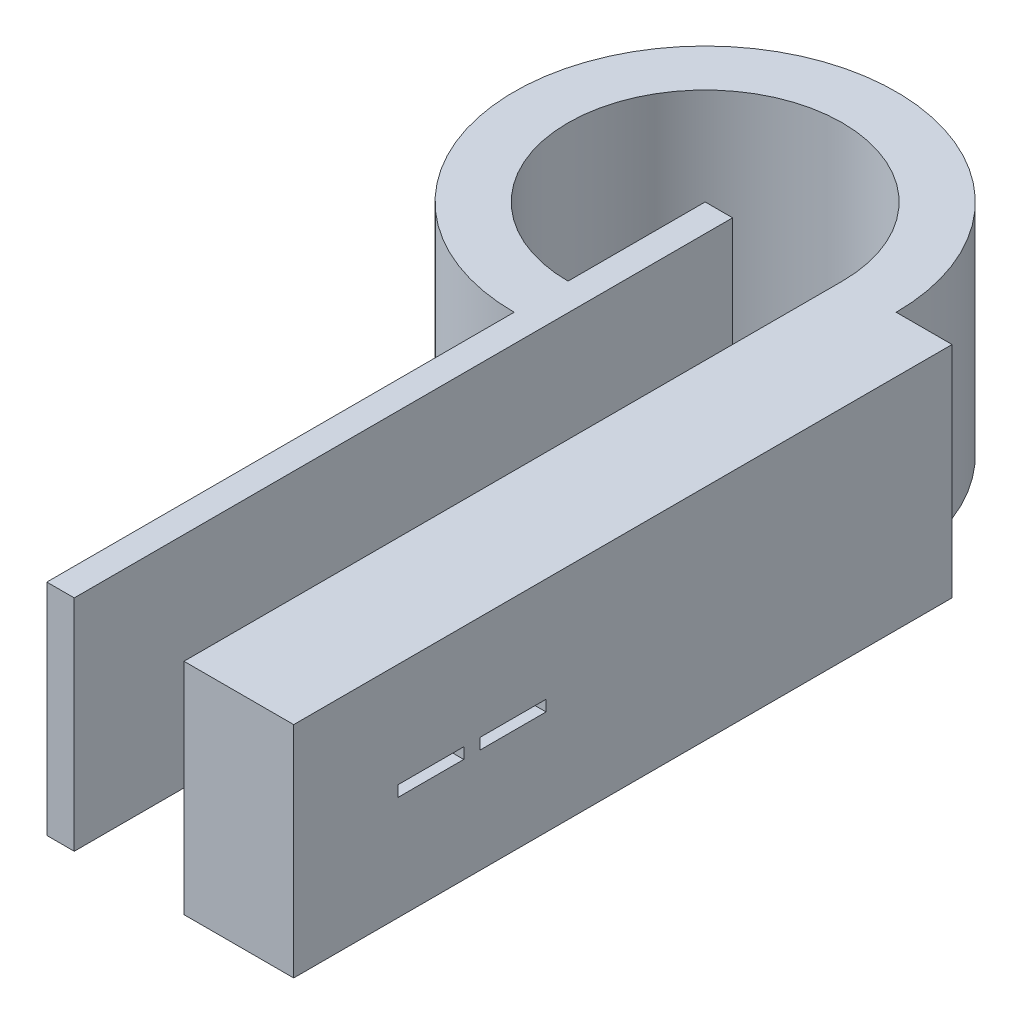
ISO-10303-21;
HEADER;
FILE_DESCRIPTION(('STEP AP214'),'2;1');
FILE_NAME('part.step','',(''),(''),'','','');
FILE_SCHEMA(('AUTOMOTIVE_DESIGN { 1 0 10303 214 1 1 1 1 }'));
ENDSEC;
DATA;
#1=APPLICATION_CONTEXT('core data for automotive mechanical design processes');
#2=APPLICATION_PROTOCOL_DEFINITION('international standard','automotive_design',2000,#1);
#3=PRODUCT_CONTEXT('',#1,'mechanical');
#4=PRODUCT('Part','Part','',(#3));
#5=PRODUCT_RELATED_PRODUCT_CATEGORY('part','',(#4));
#6=PRODUCT_DEFINITION_FORMATION('','',#4);
#7=PRODUCT_DEFINITION_CONTEXT('part definition',#1,'design');
#8=PRODUCT_DEFINITION('design','',#6,#7);
#9=PRODUCT_DEFINITION_SHAPE('','',#8);
#10=(LENGTH_UNIT() NAMED_UNIT(*) SI_UNIT(.MILLI.,.METRE.));
#11=(NAMED_UNIT(*) PLANE_ANGLE_UNIT() SI_UNIT($,.RADIAN.));
#12=(NAMED_UNIT(*) SI_UNIT($,.STERADIAN.) SOLID_ANGLE_UNIT());
#13=UNCERTAINTY_MEASURE_WITH_UNIT(LENGTH_MEASURE(1.E-05),#10,'distance_accuracy_value','');
#14=(GEOMETRIC_REPRESENTATION_CONTEXT(3) GLOBAL_UNCERTAINTY_ASSIGNED_CONTEXT((#13)) GLOBAL_UNIT_ASSIGNED_CONTEXT((#10,
#11,#12)) REPRESENTATION_CONTEXT('',''));
#15=CARTESIAN_POINT('',(0.,0.,0.));
#16=DIRECTION('',(0.,0.,1.));
#17=DIRECTION('',(1.,0.,0.));
#18=AXIS2_PLACEMENT_3D('',#15,#16,#17);
#19=CARTESIAN_POINT('',(-31.301242738674,20.,0.));
#20=DIRECTION('',(1.,0.,0.));
#21=DIRECTION('',(0.,0.,-1.));
#22=AXIS2_PLACEMENT_3D('',#19,#20,#21);
#23=PLANE('',#22);
#24=DIRECTION('',(0.,0.,1.));
#25=VECTOR('',#24,1.);
#26=CARTESIAN_POINT('',(-31.301242738674,0.,0.));
#27=LINE('',#26,#25);
#28=CARTESIAN_POINT('',(-31.301242738674,0.,-22.7488967204412));
#29=VERTEX_POINT('',#28);
#30=CARTESIAN_POINT('',(-31.301242738674,0.,37.2511032795588));
#31=VERTEX_POINT('',#30);
#32=EDGE_CURVE('E367',#29,#31,#27,.T.);
#33=ORIENTED_EDGE('',*,*,#32,.T.);
#34=DIRECTION('',(0.,-1.,0.));
#35=VECTOR('',#34,1.);
#36=CARTESIAN_POINT('',(-31.301242738674,20.,37.2511032795588));
#37=LINE('',#36,#35);
#38=CARTESIAN_POINT('',(-31.301242738674,20.,37.2511032795588));
#39=VERTEX_POINT('',#38);
#40=EDGE_CURVE('E400',#39,#31,#37,.T.);
#41=ORIENTED_EDGE('',*,*,#40,.F.);
#42=DIRECTION('',(0.,0.,1.));
#43=VECTOR('',#42,1.);
#44=CARTESIAN_POINT('',(-31.301242738674,20.,0.));
#45=LINE('',#44,#43);
#46=CARTESIAN_POINT('',(-31.301242738674,20.,-22.7488967204412));
#47=VERTEX_POINT('',#46);
#48=EDGE_CURVE('E343',#47,#39,#45,.T.);
#49=ORIENTED_EDGE('',*,*,#48,.F.);
#50=DIRECTION('',(0.,-1.,0.));
#51=VECTOR('',#50,1.);
#52=CARTESIAN_POINT('',(-31.301242738674,20.,-22.7488967204412));
#53=LINE('',#52,#51);
#54=EDGE_CURVE('E404',#47,#29,#53,.T.);
#55=ORIENTED_EDGE('',*,*,#54,.T.);
#56=EDGE_LOOP('',(#33,#41,#49,#55));
#57=FACE_BOUND('',#56,.T.);
#58=CARTESIAN_POINT('',(-31.301242738674,10.,17.2511032795588));
#59=DIRECTION('',(-1.,0.,0.));
#60=DIRECTION('',(0.,0.,1.));
#61=AXIS2_PLACEMENT_3D('',#58,#59,#60);
#62=CIRCLE('',#61,4.);
#63=CARTESIAN_POINT('',(-31.301242738674,10.,21.2511032795588));
#64=VERTEX_POINT('',#63);
#65=EDGE_CURVE('E293',#64,#64,#62,.T.);
#66=ORIENTED_EDGE('',*,*,#65,.F.);
#67=EDGE_LOOP('',(#66));
#68=FACE_BOUND('',#67,.T.);
#69=DIRECTION('',(0.,0.,1.));
#70=VECTOR('',#69,1.);
#71=CARTESIAN_POINT('',(-31.301242738674,10.5,0.));
#72=LINE('',#71,#70);
#73=CARTESIAN_POINT('',(-31.301242738674,10.5,21.7511032795588));
#74=VERTEX_POINT('',#73);
#75=CARTESIAN_POINT('',(-31.301242738674,10.5,22.1996331151242));
#76=VERTEX_POINT('',#75);
#77=EDGE_CURVE('E248',#74,#76,#72,.T.);
#78=ORIENTED_EDGE('',*,*,#77,.T.);
#79=CARTESIAN_POINT('',(-31.301242738674,10.,24.7511032795588));
#80=DIRECTION('',(-1.,0.,0.));
#81=DIRECTION('',(0.,0.,1.));
#82=AXIS2_PLACEMENT_3D('',#79,#80,#81);
#83=CIRCLE('',#82,2.6);
#84=CARTESIAN_POINT('',(-31.301242738674,10.5,27.3025734439934));
#85=VERTEX_POINT('',#84);
#86=EDGE_CURVE('E235',#85,#76,#83,.T.);
#87=ORIENTED_EDGE('',*,*,#86,.F.);
#88=CARTESIAN_POINT('',(-31.301242738674,10.5,27.7511032795588));
#89=VERTEX_POINT('',#88);
#90=EDGE_CURVE('E244',#85,#89,#72,.T.);
#91=ORIENTED_EDGE('',*,*,#90,.T.);
#92=DIRECTION('',(0.,-1.,0.));
#93=VECTOR('',#92,1.);
#94=CARTESIAN_POINT('',(-31.301242738674,0.,27.7511032795588));
#95=LINE('',#94,#93);
#96=CARTESIAN_POINT('',(-31.301242738674,9.5,27.7511032795588));
#97=VERTEX_POINT('',#96);
#98=EDGE_CURVE('E261',#89,#97,#95,.T.);
#99=ORIENTED_EDGE('',*,*,#98,.T.);
#100=DIRECTION('',(0.,0.,1.));
#101=VECTOR('',#100,1.);
#102=CARTESIAN_POINT('',(-31.301242738674,9.5,0.));
#103=LINE('',#102,#101);
#104=CARTESIAN_POINT('',(-31.301242738674,9.5,27.3025734439934));
#105=VERTEX_POINT('',#104);
#106=EDGE_CURVE('E268',#105,#97,#103,.T.);
#107=ORIENTED_EDGE('',*,*,#106,.F.);
#108=CARTESIAN_POINT('',(-31.301242738674,9.5,22.1996331151242));
#109=VERTEX_POINT('',#108);
#110=EDGE_CURVE('E250',#109,#105,#83,.T.);
#111=ORIENTED_EDGE('',*,*,#110,.F.);
#112=CARTESIAN_POINT('',(-31.301242738674,9.5,21.7511032795588));
#113=VERTEX_POINT('',#112);
#114=EDGE_CURVE('E269',#113,#109,#103,.T.);
#115=ORIENTED_EDGE('',*,*,#114,.F.);
#116=DIRECTION('',(0.,-1.,0.));
#117=VECTOR('',#116,1.);
#118=CARTESIAN_POINT('',(-31.301242738674,0.,21.7511032795588));
#119=LINE('',#118,#117);
#120=EDGE_CURVE('E257',#74,#113,#119,.T.);
#121=ORIENTED_EDGE('',*,*,#120,.F.);
#122=EDGE_LOOP('',(#78,#87,#91,#99,#107,#111,#115,#121));
#123=FACE_BOUND('',#122,.T.);
#124=ADVANCED_FACE('F78',(#57,#68,#123),#23,.F.);
#125=CARTESIAN_POINT('',(-21.301242738674,20.,0.));
#126=DIRECTION('',(1.,0.,0.));
#127=DIRECTION('',(0.,0.,-1.));
#128=AXIS2_PLACEMENT_3D('',#125,#126,#127);
#129=PLANE('',#128);
#130=DIRECTION('',(0.,0.,1.));
#131=VECTOR('',#130,1.);
#132=CARTESIAN_POINT('',(-21.301242738674,0.,0.));
#133=LINE('',#132,#131);
#134=CARTESIAN_POINT('',(-21.301242738674,0.,-22.7488967204412));
#135=VERTEX_POINT('',#134);
#136=CARTESIAN_POINT('',(-21.301242738674,0.,37.2511032795588));
#137=VERTEX_POINT('',#136);
#138=EDGE_CURVE('E375',#135,#137,#133,.T.);
#139=ORIENTED_EDGE('',*,*,#138,.F.);
#140=DIRECTION('',(0.,-1.,0.));
#141=VECTOR('',#140,1.);
#142=CARTESIAN_POINT('',(-21.301242738674,20.,-22.7488967204412));
#143=LINE('',#142,#141);
#144=CARTESIAN_POINT('',(-21.301242738674,20.,-22.7488967204412));
#145=VERTEX_POINT('',#144);
#146=EDGE_CURVE('E394',#145,#135,#143,.T.);
#147=ORIENTED_EDGE('',*,*,#146,.F.);
#148=DIRECTION('',(0.,0.,1.));
#149=VECTOR('',#148,1.);
#150=CARTESIAN_POINT('',(-21.301242738674,20.,0.));
#151=LINE('',#150,#149);
#152=CARTESIAN_POINT('',(-21.301242738674,20.,37.2511032795588));
#153=VERTEX_POINT('',#152);
#154=EDGE_CURVE('E350',#145,#153,#151,.T.);
#155=ORIENTED_EDGE('',*,*,#154,.T.);
#156=DIRECTION('',(0.,-1.,0.));
#157=VECTOR('',#156,1.);
#158=CARTESIAN_POINT('',(-21.301242738674,20.,37.2511032795588));
#159=LINE('',#158,#157);
#160=EDGE_CURVE('E397',#153,#137,#159,.T.);
#161=ORIENTED_EDGE('',*,*,#160,.T.);
#162=EDGE_LOOP('',(#139,#147,#155,#161));
#163=FACE_BOUND('',#162,.T.);
#164=DIRECTION('',(0.,-1.,0.));
#165=VECTOR('',#164,1.);
#166=CARTESIAN_POINT('',(-21.301242738674,0.,14.2511032795588));
#167=LINE('',#166,#165);
#168=CARTESIAN_POINT('',(-21.301242738674,10.5,14.2511032795588));
#169=VERTEX_POINT('',#168);
#170=CARTESIAN_POINT('',(-21.301242738674,9.5,14.2511032795588));
#171=VERTEX_POINT('',#170);
#172=EDGE_CURVE('E306',#169,#171,#167,.T.);
#173=ORIENTED_EDGE('',*,*,#172,.T.);
#174=DIRECTION('',(0.,0.,1.));
#175=VECTOR('',#174,1.);
#176=CARTESIAN_POINT('',(-21.301242738674,9.5,0.));
#177=LINE('',#176,#175);
#178=CARTESIAN_POINT('',(-21.301242738674,9.5,20.2511032795588));
#179=VERTEX_POINT('',#178);
#180=EDGE_CURVE('E302',#171,#179,#177,.T.);
#181=ORIENTED_EDGE('',*,*,#180,.T.);
#182=DIRECTION('',(0.,-1.,0.));
#183=VECTOR('',#182,1.);
#184=CARTESIAN_POINT('',(-21.301242738674,0.,20.2511032795588));
#185=LINE('',#184,#183);
#186=CARTESIAN_POINT('',(-21.301242738674,10.5,20.2511032795588));
#187=VERTEX_POINT('',#186);
#188=EDGE_CURVE('E315',#187,#179,#185,.T.);
#189=ORIENTED_EDGE('',*,*,#188,.F.);
#190=DIRECTION('',(0.,0.,1.));
#191=VECTOR('',#190,1.);
#192=CARTESIAN_POINT('',(-21.301242738674,10.5,0.));
#193=LINE('',#192,#191);
#194=EDGE_CURVE('E311',#169,#187,#193,.T.);
#195=ORIENTED_EDGE('',*,*,#194,.F.);
#196=EDGE_LOOP('',(#173,#181,#189,#195));
#197=FACE_BOUND('',#196,.T.);
#198=DIRECTION('',(0.,0.,1.));
#199=VECTOR('',#198,1.);
#200=CARTESIAN_POINT('',(-21.301242738674,10.5,0.));
#201=LINE('',#200,#199);
#202=CARTESIAN_POINT('',(-21.301242738674,10.5,21.7511032795588));
#203=VERTEX_POINT('',#202);
#204=CARTESIAN_POINT('',(-21.301242738674,10.5,27.7511032795588));
#205=VERTEX_POINT('',#204);
#206=EDGE_CURVE('E278',#203,#205,#201,.T.);
#207=ORIENTED_EDGE('',*,*,#206,.F.);
#208=DIRECTION('',(0.,-1.,0.));
#209=VECTOR('',#208,1.);
#210=CARTESIAN_POINT('',(-21.301242738674,0.,21.7511032795588));
#211=LINE('',#210,#209);
#212=CARTESIAN_POINT('',(-21.301242738674,9.5,21.7511032795588));
#213=VERTEX_POINT('',#212);
#214=EDGE_CURVE('E274',#203,#213,#211,.T.);
#215=ORIENTED_EDGE('',*,*,#214,.T.);
#216=DIRECTION('',(0.,0.,1.));
#217=VECTOR('',#216,1.);
#218=CARTESIAN_POINT('',(-21.301242738674,9.5,0.));
#219=LINE('',#218,#217);
#220=CARTESIAN_POINT('',(-21.301242738674,9.5,27.7511032795588));
#221=VERTEX_POINT('',#220);
#222=EDGE_CURVE('E262',#213,#221,#219,.T.);
#223=ORIENTED_EDGE('',*,*,#222,.T.);
#224=DIRECTION('',(0.,-1.,0.));
#225=VECTOR('',#224,1.);
#226=CARTESIAN_POINT('',(-21.301242738674,0.,27.7511032795588));
#227=LINE('',#226,#225);
#228=EDGE_CURVE('E282',#205,#221,#227,.T.);
#229=ORIENTED_EDGE('',*,*,#228,.F.);
#230=EDGE_LOOP('',(#207,#215,#223,#229));
#231=FACE_BOUND('',#230,.T.);
#232=ADVANCED_FACE('F480',(#163,#197,#231),#129,.T.);
#233=CARTESIAN_POINT('',(-23.301242738674,0.,0.));
#234=DIRECTION('',(-1.,0.,0.));
#235=DIRECTION('',(0.,0.,1.));
#236=AXIS2_PLACEMENT_3D('',#233,#234,#235);
#237=PLANE('',#236);
#238=CARTESIAN_POINT('',(-23.301242738674,10.,17.2511032795588));
#239=DIRECTION('',(-1.,0.,0.));
#240=DIRECTION('',(0.,0.,1.));
#241=AXIS2_PLACEMENT_3D('',#238,#239,#240);
#242=CIRCLE('',#241,4.);
#243=CARTESIAN_POINT('',(-23.301242738674,10.,21.2511032795588));
#244=VERTEX_POINT('',#243);
#245=EDGE_CURVE('E331',#244,#244,#242,.T.);
#246=ORIENTED_EDGE('',*,*,#245,.T.);
#247=EDGE_LOOP('',(#246));
#248=FACE_BOUND('',#247,.T.);
#249=DIRECTION('',(0.,1.,0.));
#250=VECTOR('',#249,1.);
#251=CARTESIAN_POINT('',(-23.301242738674,0.,20.2511032795588));
#252=LINE('',#251,#250);
#253=CARTESIAN_POINT('',(-23.301242738674,9.5,20.2511032795588));
#254=VERTEX_POINT('',#253);
#255=CARTESIAN_POINT('',(-23.301242738674,10.5,20.2511032795588));
#256=VERTEX_POINT('',#255);
#257=EDGE_CURVE('E459',#254,#256,#252,.T.);
#258=ORIENTED_EDGE('',*,*,#257,.F.);
#259=DIRECTION('',(0.,0.,-1.));
#260=VECTOR('',#259,1.);
#261=CARTESIAN_POINT('',(-23.301242738674,9.5,0.));
#262=LINE('',#261,#260);
#263=CARTESIAN_POINT('',(-23.301242738674,9.5,14.2511032795588));
#264=VERTEX_POINT('',#263);
#265=EDGE_CURVE('E462',#254,#264,#262,.T.);
#266=ORIENTED_EDGE('',*,*,#265,.T.);
#267=DIRECTION('',(0.,1.,0.));
#268=VECTOR('',#267,1.);
#269=CARTESIAN_POINT('',(-23.301242738674,0.,14.2511032795588));
#270=LINE('',#269,#268);
#271=CARTESIAN_POINT('',(-23.301242738674,10.5,14.2511032795588));
#272=VERTEX_POINT('',#271);
#273=EDGE_CURVE('E407',#264,#272,#270,.T.);
#274=ORIENTED_EDGE('',*,*,#273,.T.);
#275=DIRECTION('',(0.,0.,-1.));
#276=VECTOR('',#275,1.);
#277=CARTESIAN_POINT('',(-23.301242738674,10.5,0.));
#278=LINE('',#277,#276);
#279=EDGE_CURVE('E455',#256,#272,#278,.T.);
#280=ORIENTED_EDGE('',*,*,#279,.F.);
#281=EDGE_LOOP('',(#258,#266,#274,#280));
#282=FACE_BOUND('',#281,.T.);
#283=ADVANCED_FACE('F553',(#248,#282),#237,.T.);
#284=CARTESIAN_POINT('',(0.,20.,37.2511032795588));
#285=DIRECTION('',(0.,0.,-1.));
#286=DIRECTION('',(-1.,0.,0.));
#287=AXIS2_PLACEMENT_3D('',#284,#285,#286);
#288=PLANE('',#287);
#289=DIRECTION('',(1.,0.,0.));
#290=VECTOR('',#289,1.);
#291=CARTESIAN_POINT('',(0.,0.,37.2511032795588));
#292=LINE('',#291,#290);
#293=EDGE_CURVE('E371',#31,#137,#292,.T.);
#294=ORIENTED_EDGE('',*,*,#293,.T.);
#295=ORIENTED_EDGE('',*,*,#160,.F.);
#296=DIRECTION('',(1.,0.,0.));
#297=VECTOR('',#296,1.);
#298=CARTESIAN_POINT('',(0.,20.,37.2511032795588));
#299=LINE('',#298,#297);
#300=EDGE_CURVE('E347',#39,#153,#299,.T.);
#301=ORIENTED_EDGE('',*,*,#300,.F.);
#302=ORIENTED_EDGE('',*,*,#40,.T.);
#303=EDGE_LOOP('',(#294,#295,#301,#302));
#304=FACE_BOUND('',#303,.T.);
#305=ADVANCED_FACE('F526',(#304),#288,.F.);
#306=CARTESIAN_POINT('',(0.,20.,-22.7488967204412));
#307=DIRECTION('',(0.,0.,-1.));
#308=DIRECTION('',(-1.,0.,0.));
#309=AXIS2_PLACEMENT_3D('',#306,#307,#308);
#310=PLANE('',#309);
#311=DIRECTION('',(1.,0.,0.));
#312=VECTOR('',#311,1.);
#313=CARTESIAN_POINT('',(0.,0.,-22.7488967204412));
#314=LINE('',#313,#312);
#315=CARTESIAN_POINT('',(-26.392335279018,0.,-22.7488967204412));
#316=VERTEX_POINT('',#315);
#317=EDGE_CURVE('E379',#316,#135,#314,.T.);
#318=ORIENTED_EDGE('',*,*,#317,.F.);
#319=DIRECTION('',(0.,-1.,0.));
#320=VECTOR('',#319,1.);
#321=CARTESIAN_POINT('',(-26.392335279018,20.,-22.7488967204412));
#322=LINE('',#321,#320);
#323=CARTESIAN_POINT('',(-26.392335279018,20.,-22.7488967204412));
#324=VERTEX_POINT('',#323);
#325=EDGE_CURVE('E391',#324,#316,#322,.T.);
#326=ORIENTED_EDGE('',*,*,#325,.F.);
#327=DIRECTION('',(1.,0.,0.));
#328=VECTOR('',#327,1.);
#329=CARTESIAN_POINT('',(0.,20.,-22.7488967204412));
#330=LINE('',#329,#328);
#331=EDGE_CURVE('E354',#324,#145,#330,.T.);
#332=ORIENTED_EDGE('',*,*,#331,.T.);
#333=ORIENTED_EDGE('',*,*,#146,.T.);
#334=EDGE_LOOP('',(#318,#326,#332,#333));
#335=FACE_BOUND('',#334,.T.);
#336=ADVANCED_FACE('F533',(#335),#310,.T.);
#337=CARTESIAN_POINT('',(-43.801242738674,20.,-22.7488967204412));
#338=DIRECTION('',(0.,-1.,0.));
#339=DIRECTION('',(0.,0.,-1.));
#340=AXIS2_PLACEMENT_3D('',#337,#338,#339);
#341=CYLINDRICAL_SURFACE('',#340,17.4089074596559);
#342=CARTESIAN_POINT('',(-43.801242738674,0.,-22.7488967204412));
#343=DIRECTION('',(0.,1.,0.));
#344=DIRECTION('',(0.,0.,1.));
#345=AXIS2_PLACEMENT_3D('',#342,#343,#344);
#346=CIRCLE('',#345,17.4089074596559);
#347=CARTESIAN_POINT('',(-43.801242738674,0.,-5.33998926078527));
#348=VERTEX_POINT('',#347);
#349=EDGE_CURVE('E344',#316,#348,#346,.T.);
#350=ORIENTED_EDGE('',*,*,#349,.T.);
#351=DIRECTION('',(0.,-1.,0.));
#352=VECTOR('',#351,1.);
#353=CARTESIAN_POINT('',(-43.801242738674,20.,-5.33998926078527));
#354=LINE('',#353,#352);
#355=CARTESIAN_POINT('',(-43.801242738674,20.,-5.33998926078527));
#356=VERTEX_POINT('',#355);
#357=EDGE_CURVE('E388',#356,#348,#354,.T.);
#358=ORIENTED_EDGE('',*,*,#357,.F.);
#359=CARTESIAN_POINT('',(-43.801242738674,20.,-22.7488967204412));
#360=DIRECTION('',(0.,1.,0.));
#361=DIRECTION('',(0.,0.,1.));
#362=AXIS2_PLACEMENT_3D('',#359,#360,#361);
#363=CIRCLE('',#362,17.4089074596559);
#364=EDGE_CURVE('E358',#324,#356,#363,.T.);
#365=ORIENTED_EDGE('',*,*,#364,.F.);
#366=ORIENTED_EDGE('',*,*,#325,.T.);
#367=EDGE_LOOP('',(#350,#358,#365,#366));
#368=FACE_BOUND('',#367,.T.);
#369=ADVANCED_FACE('F536',(#368),#341,.T.);
#370=CARTESIAN_POINT('',(-43.801242738674,20.,-22.7488967204412));
#371=DIRECTION('',(0.,-1.,0.));
#372=DIRECTION('',(0.,0.,-1.));
#373=AXIS2_PLACEMENT_3D('',#370,#371,#372);
#374=CYLINDRICAL_SURFACE('',#373,12.5);
#375=CARTESIAN_POINT('',(-43.801242738674,0.,-22.7488967204412));
#376=DIRECTION('',(0.,1.,0.));
#377=DIRECTION('',(0.,0.,1.));
#378=AXIS2_PLACEMENT_3D('',#375,#376,#377);
#379=CIRCLE('',#378,12.5);
#380=CARTESIAN_POINT('',(-43.801242738674,0.,-10.2488967204412));
#381=VERTEX_POINT('',#380);
#382=EDGE_CURVE('E363',#29,#381,#379,.T.);
#383=ORIENTED_EDGE('',*,*,#382,.F.);
#384=ORIENTED_EDGE('',*,*,#54,.F.);
#385=CARTESIAN_POINT('',(-43.801242738674,20.,-22.7488967204412));
#386=DIRECTION('',(0.,1.,0.));
#387=DIRECTION('',(0.,0.,1.));
#388=AXIS2_PLACEMENT_3D('',#385,#386,#387);
#389=CIRCLE('',#388,12.5);
#390=CARTESIAN_POINT('',(-43.801242738674,20.,-10.2488967204412));
#391=VERTEX_POINT('',#390);
#392=EDGE_CURVE('E339',#47,#391,#389,.T.);
#393=ORIENTED_EDGE('',*,*,#392,.T.);
#394=DIRECTION('',(0.,-1.,0.));
#395=VECTOR('',#394,1.);
#396=CARTESIAN_POINT('',(-43.801242738674,20.,-10.2488967204412));
#397=LINE('',#396,#395);
#398=EDGE_CURVE('E362',#391,#381,#397,.T.);
#399=ORIENTED_EDGE('',*,*,#398,.T.);
#400=EDGE_LOOP('',(#383,#384,#393,#399));
#401=FACE_BOUND('',#400,.T.);
#402=ADVANCED_FACE('F516',(#401),#374,.F.);
#403=CARTESIAN_POINT('',(0.,0.,0.));
#404=DIRECTION('',(0.,1.,0.));
#405=DIRECTION('',(0.,0.,1.));
#406=AXIS2_PLACEMENT_3D('',#403,#404,#405);
#407=PLANE('',#406);
#408=ORIENTED_EDGE('',*,*,#382,.T.);
#409=DIRECTION('',(0.,0.,1.));
#410=VECTOR('',#409,1.);
#411=CARTESIAN_POINT('',(-43.801242738674,0.,-22.7488967204412));
#412=LINE('',#411,#410);
#413=CARTESIAN_POINT('',(-43.801242738674,0.,-22.7488967204412));
#414=VERTEX_POINT('',#413);
#415=EDGE_CURVE('E413',#414,#381,#412,.T.);
#416=ORIENTED_EDGE('',*,*,#415,.F.);
#417=DIRECTION('',(1.,0.,0.));
#418=VECTOR('',#417,1.);
#419=CARTESIAN_POINT('',(-43.801242738674,0.,-22.7488967204412));
#420=LINE('',#419,#418);
#421=CARTESIAN_POINT('',(-41.301242738674,0.,-22.7488967204412));
#422=VERTEX_POINT('',#421);
#423=EDGE_CURVE('E335',#414,#422,#420,.T.);
#424=ORIENTED_EDGE('',*,*,#423,.T.);
#425=DIRECTION('',(0.,0.,1.));
#426=VECTOR('',#425,1.);
#427=CARTESIAN_POINT('',(-41.301242738674,0.,-22.7488967204412));
#428=LINE('',#427,#426);
#429=CARTESIAN_POINT('',(-41.301242738674,0.,37.2511032795588));
#430=VERTEX_POINT('',#429);
#431=EDGE_CURVE('E429',#422,#430,#428,.T.);
#432=ORIENTED_EDGE('',*,*,#431,.T.);
#433=DIRECTION('',(1.,0.,0.));
#434=VECTOR('',#433,1.);
#435=CARTESIAN_POINT('',(-43.801242738674,0.,37.2511032795588));
#436=LINE('',#435,#434);
#437=CARTESIAN_POINT('',(-43.801242738674,0.,37.2511032795588));
#438=VERTEX_POINT('',#437);
#439=EDGE_CURVE('E433',#438,#430,#436,.T.);
#440=ORIENTED_EDGE('',*,*,#439,.F.);
#441=EDGE_CURVE('E437',#348,#438,#412,.T.);
#442=ORIENTED_EDGE('',*,*,#441,.F.);
#443=ORIENTED_EDGE('',*,*,#349,.F.);
#444=ORIENTED_EDGE('',*,*,#317,.T.);
#445=ORIENTED_EDGE('',*,*,#138,.T.);
#446=ORIENTED_EDGE('',*,*,#293,.F.);
#447=ORIENTED_EDGE('',*,*,#32,.F.);
#448=EDGE_LOOP('',(#408,#416,#424,#432,#440,#442,#443,#444,#445,#446,#447));
#449=FACE_BOUND('',#448,.T.);
#450=ADVANCED_FACE('F538',(#449),#407,.F.);
#451=CARTESIAN_POINT('',(0.,20.,0.));
#452=DIRECTION('',(0.,1.,0.));
#453=DIRECTION('',(0.,0.,1.));
#454=AXIS2_PLACEMENT_3D('',#451,#452,#453);
#455=PLANE('',#454);
#456=ORIENTED_EDGE('',*,*,#392,.F.);
#457=ORIENTED_EDGE('',*,*,#48,.T.);
#458=ORIENTED_EDGE('',*,*,#300,.T.);
#459=ORIENTED_EDGE('',*,*,#154,.F.);
#460=ORIENTED_EDGE('',*,*,#331,.F.);
#461=ORIENTED_EDGE('',*,*,#364,.T.);
#462=DIRECTION('',(0.,0.,1.));
#463=VECTOR('',#462,1.);
#464=CARTESIAN_POINT('',(-43.801242738674,20.,-22.7488967204412));
#465=LINE('',#464,#463);
#466=CARTESIAN_POINT('',(-43.801242738674,20.,37.2511032795588));
#467=VERTEX_POINT('',#466);
#468=EDGE_CURVE('E420',#356,#467,#465,.T.);
#469=ORIENTED_EDGE('',*,*,#468,.T.);
#470=DIRECTION('',(1.,0.,0.));
#471=VECTOR('',#470,1.);
#472=CARTESIAN_POINT('',(-43.801242738674,20.,37.2511032795588));
#473=LINE('',#472,#471);
#474=CARTESIAN_POINT('',(-41.301242738674,20.,37.2511032795588));
#475=VERTEX_POINT('',#474);
#476=EDGE_CURVE('E417',#467,#475,#473,.T.);
#477=ORIENTED_EDGE('',*,*,#476,.T.);
#478=DIRECTION('',(0.,0.,1.));
#479=VECTOR('',#478,1.);
#480=CARTESIAN_POINT('',(-41.301242738674,20.,-22.7488967204412));
#481=LINE('',#480,#479);
#482=CARTESIAN_POINT('',(-41.301242738674,20.,-22.7488967204412));
#483=VERTEX_POINT('',#482);
#484=EDGE_CURVE('E412',#483,#475,#481,.T.);
#485=ORIENTED_EDGE('',*,*,#484,.F.);
#486=DIRECTION('',(1.,0.,0.));
#487=VECTOR('',#486,1.);
#488=CARTESIAN_POINT('',(-43.801242738674,20.,-22.7488967204412));
#489=LINE('',#488,#487);
#490=CARTESIAN_POINT('',(-43.801242738674,20.,-22.7488967204412));
#491=VERTEX_POINT('',#490);
#492=EDGE_CURVE('E408',#491,#483,#489,.T.);
#493=ORIENTED_EDGE('',*,*,#492,.F.);
#494=EDGE_CURVE('E421',#491,#391,#465,.T.);
#495=ORIENTED_EDGE('',*,*,#494,.T.);
#496=EDGE_LOOP('',(#456,#457,#458,#459,#460,#461,#469,#477,#485,#493,#495));
#497=FACE_BOUND('',#496,.T.);
#498=ADVANCED_FACE('F492',(#497),#455,.T.);
#499=CARTESIAN_POINT('',(-43.801242738674,20.,-22.7488967204412));
#500=DIRECTION('',(1.,0.,0.));
#501=DIRECTION('',(0.,0.,-1.));
#502=AXIS2_PLACEMENT_3D('',#499,#500,#501);
#503=PLANE('',#502);
#504=ORIENTED_EDGE('',*,*,#398,.F.);
#505=ORIENTED_EDGE('',*,*,#494,.F.);
#506=DIRECTION('',(0.,-1.,0.));
#507=VECTOR('',#506,1.);
#508=CARTESIAN_POINT('',(-43.801242738674,20.,-22.7488967204412));
#509=LINE('',#508,#507);
#510=EDGE_CURVE('E368',#491,#414,#509,.T.);
#511=ORIENTED_EDGE('',*,*,#510,.T.);
#512=ORIENTED_EDGE('',*,*,#415,.T.);
#513=EDGE_LOOP('',(#504,#505,#511,#512));
#514=FACE_BOUND('',#513,.T.);
#515=ADVANCED_FACE('F513',(#514),#503,.F.);
#516=ORIENTED_EDGE('',*,*,#468,.F.);
#517=ORIENTED_EDGE('',*,*,#357,.T.);
#518=ORIENTED_EDGE('',*,*,#441,.T.);
#519=DIRECTION('',(0.,-1.,0.));
#520=VECTOR('',#519,1.);
#521=CARTESIAN_POINT('',(-43.801242738674,20.,37.2511032795588));
#522=LINE('',#521,#520);
#523=EDGE_CURVE('E443',#467,#438,#522,.T.);
#524=ORIENTED_EDGE('',*,*,#523,.F.);
#525=EDGE_LOOP('',(#516,#517,#518,#524));
#526=FACE_BOUND('',#525,.T.);
#527=ADVANCED_FACE('F499',(#526),#503,.F.);
#528=CARTESIAN_POINT('',(-43.801242738674,20.,37.2511032795588));
#529=DIRECTION('',(0.,0.,-1.));
#530=DIRECTION('',(-1.,0.,0.));
#531=AXIS2_PLACEMENT_3D('',#528,#529,#530);
#532=PLANE('',#531);
#533=ORIENTED_EDGE('',*,*,#439,.T.);
#534=DIRECTION('',(0.,-1.,0.));
#535=VECTOR('',#534,1.);
#536=CARTESIAN_POINT('',(-41.301242738674,20.,37.2511032795588));
#537=LINE('',#536,#535);
#538=EDGE_CURVE('E447',#475,#430,#537,.T.);
#539=ORIENTED_EDGE('',*,*,#538,.F.);
#540=ORIENTED_EDGE('',*,*,#476,.F.);
#541=ORIENTED_EDGE('',*,*,#523,.T.);
#542=EDGE_LOOP('',(#533,#539,#540,#541));
#543=FACE_BOUND('',#542,.T.);
#544=ADVANCED_FACE('F503',(#543),#532,.F.);
#545=CARTESIAN_POINT('',(-41.301242738674,20.,-22.7488967204412));
#546=DIRECTION('',(1.,0.,0.));
#547=DIRECTION('',(0.,0.,-1.));
#548=AXIS2_PLACEMENT_3D('',#545,#546,#547);
#549=PLANE('',#548);
#550=ORIENTED_EDGE('',*,*,#431,.F.);
#551=DIRECTION('',(0.,-1.,0.));
#552=VECTOR('',#551,1.);
#553=CARTESIAN_POINT('',(-41.301242738674,20.,-22.7488967204412));
#554=LINE('',#553,#552);
#555=EDGE_CURVE('E425',#483,#422,#554,.T.);
#556=ORIENTED_EDGE('',*,*,#555,.F.);
#557=ORIENTED_EDGE('',*,*,#484,.T.);
#558=ORIENTED_EDGE('',*,*,#538,.T.);
#559=EDGE_LOOP('',(#550,#556,#557,#558));
#560=FACE_BOUND('',#559,.T.);
#561=ADVANCED_FACE('F506',(#560),#549,.T.);
#562=CARTESIAN_POINT('',(-43.801242738674,20.,-22.7488967204412));
#563=DIRECTION('',(0.,0.,-1.));
#564=DIRECTION('',(-1.,0.,0.));
#565=AXIS2_PLACEMENT_3D('',#562,#563,#564);
#566=PLANE('',#565);
#567=ORIENTED_EDGE('',*,*,#423,.F.);
#568=ORIENTED_EDGE('',*,*,#510,.F.);
#569=ORIENTED_EDGE('',*,*,#492,.T.);
#570=ORIENTED_EDGE('',*,*,#555,.T.);
#571=EDGE_LOOP('',(#567,#568,#569,#570));
#572=FACE_BOUND('',#571,.T.);
#573=ADVANCED_FACE('F80',(#572),#566,.T.);
#574=CARTESIAN_POINT('',(-23.301242738674,10.,17.2511032795588));
#575=DIRECTION('',(-1.,0.,0.));
#576=DIRECTION('',(0.,0.,1.));
#577=AXIS2_PLACEMENT_3D('',#574,#575,#576);
#578=CYLINDRICAL_SURFACE('',#577,4.);
#579=ORIENTED_EDGE('',*,*,#245,.F.);
#580=EDGE_LOOP('',(#579));
#581=FACE_BOUND('',#580,.T.);
#582=ORIENTED_EDGE('',*,*,#65,.T.);
#583=EDGE_LOOP('',(#582));
#584=FACE_BOUND('',#583,.T.);
#585=ADVANCED_FACE('F561',(#581,#584),#578,.F.);
#586=CARTESIAN_POINT('',(-31.301242738674,9.5,0.));
#587=DIRECTION('',(0.,1.,0.));
#588=DIRECTION('',(0.,0.,1.));
#589=AXIS2_PLACEMENT_3D('',#586,#587,#588);
#590=PLANE('',#589);
#591=DIRECTION('',(1.,0.,0.));
#592=VECTOR('',#591,1.);
#593=CARTESIAN_POINT('',(-31.301242738674,9.5,20.2511032795588));
#594=LINE('',#593,#592);
#595=EDGE_CURVE('E279',#254,#179,#594,.T.);
#596=ORIENTED_EDGE('',*,*,#595,.T.);
#597=ORIENTED_EDGE('',*,*,#180,.F.);
#598=DIRECTION('',(1.,0.,0.));
#599=VECTOR('',#598,1.);
#600=CARTESIAN_POINT('',(-31.301242738674,9.5,14.2511032795588));
#601=LINE('',#600,#599);
#602=EDGE_CURVE('E319',#264,#171,#601,.T.);
#603=ORIENTED_EDGE('',*,*,#602,.F.);
#604=ORIENTED_EDGE('',*,*,#265,.F.);
#605=EDGE_LOOP('',(#596,#597,#603,#604));
#606=FACE_BOUND('',#605,.T.);
#607=ADVANCED_FACE('F566',(#606),#590,.T.);
#608=CARTESIAN_POINT('',(-31.301242738674,0.,20.2511032795588));
#609=DIRECTION('',(0.,0.,1.));
#610=DIRECTION('',(1.,0.,0.));
#611=AXIS2_PLACEMENT_3D('',#608,#609,#610);
#612=PLANE('',#611);
#613=ORIENTED_EDGE('',*,*,#257,.T.);
#614=DIRECTION('',(1.,0.,0.));
#615=VECTOR('',#614,1.);
#616=CARTESIAN_POINT('',(-31.301242738674,10.5,20.2511032795588));
#617=LINE('',#616,#615);
#618=EDGE_CURVE('E322',#256,#187,#617,.T.);
#619=ORIENTED_EDGE('',*,*,#618,.T.);
#620=ORIENTED_EDGE('',*,*,#188,.T.);
#621=ORIENTED_EDGE('',*,*,#595,.F.);
#622=EDGE_LOOP('',(#613,#619,#620,#621));
#623=FACE_BOUND('',#622,.T.);
#624=ADVANCED_FACE('F572',(#623),#612,.F.);
#625=CARTESIAN_POINT('',(-31.301242738674,10.5,0.));
#626=DIRECTION('',(0.,1.,0.));
#627=DIRECTION('',(0.,0.,1.));
#628=AXIS2_PLACEMENT_3D('',#625,#626,#627);
#629=PLANE('',#628);
#630=ORIENTED_EDGE('',*,*,#279,.T.);
#631=DIRECTION('',(1.,0.,0.));
#632=VECTOR('',#631,1.);
#633=CARTESIAN_POINT('',(-31.301242738674,10.5,14.2511032795588));
#634=LINE('',#633,#632);
#635=EDGE_CURVE('E325',#272,#169,#634,.T.);
#636=ORIENTED_EDGE('',*,*,#635,.T.);
#637=ORIENTED_EDGE('',*,*,#194,.T.);
#638=ORIENTED_EDGE('',*,*,#618,.F.);
#639=EDGE_LOOP('',(#630,#636,#637,#638));
#640=FACE_BOUND('',#639,.T.);
#641=ADVANCED_FACE('F584',(#640),#629,.F.);
#642=CARTESIAN_POINT('',(-31.301242738674,0.,14.2511032795588));
#643=DIRECTION('',(0.,0.,1.));
#644=DIRECTION('',(1.,0.,0.));
#645=AXIS2_PLACEMENT_3D('',#642,#643,#644);
#646=PLANE('',#645);
#647=ORIENTED_EDGE('',*,*,#602,.T.);
#648=ORIENTED_EDGE('',*,*,#172,.F.);
#649=ORIENTED_EDGE('',*,*,#635,.F.);
#650=ORIENTED_EDGE('',*,*,#273,.F.);
#651=EDGE_LOOP('',(#647,#648,#649,#650));
#652=FACE_BOUND('',#651,.T.);
#653=ADVANCED_FACE('F581',(#652),#646,.T.);
#654=CARTESIAN_POINT('',(-31.301242738674,0.,21.7511032795588));
#655=DIRECTION('',(0.,0.,1.));
#656=DIRECTION('',(0.,-1.,0.));
#657=AXIS2_PLACEMENT_3D('',#654,#655,#656);
#658=PLANE('',#657);
#659=ORIENTED_EDGE('',*,*,#214,.F.);
#660=DIRECTION('',(1.,0.,0.));
#661=VECTOR('',#660,1.);
#662=CARTESIAN_POINT('',(-31.301242738674,10.5,21.7511032795588));
#663=LINE('',#662,#661);
#664=EDGE_CURVE('E273',#74,#203,#663,.T.);
#665=ORIENTED_EDGE('',*,*,#664,.F.);
#666=ORIENTED_EDGE('',*,*,#120,.T.);
#667=DIRECTION('',(1.,0.,0.));
#668=VECTOR('',#667,1.);
#669=CARTESIAN_POINT('',(-31.301242738674,9.5,21.7511032795588));
#670=LINE('',#669,#668);
#671=EDGE_CURVE('E289',#113,#213,#670,.T.);
#672=ORIENTED_EDGE('',*,*,#671,.T.);
#673=EDGE_LOOP('',(#659,#665,#666,#672));
#674=FACE_BOUND('',#673,.T.);
#675=ADVANCED_FACE('F473',(#674),#658,.T.);
#676=CARTESIAN_POINT('',(-31.301242738674,9.5,0.));
#677=DIRECTION('',(0.,1.,0.));
#678=DIRECTION('',(0.,0.,1.));
#679=AXIS2_PLACEMENT_3D('',#676,#677,#678);
#680=PLANE('',#679);
#681=DIRECTION('',(-1.,0.,0.));
#682=VECTOR('',#681,1.);
#683=CARTESIAN_POINT('',(-29.801242738674,9.5,22.1996331151242));
#684=LINE('',#683,#682);
#685=CARTESIAN_POINT('',(-29.801242738674,9.5,22.1996331151242));
#686=VERTEX_POINT('',#685);
#687=EDGE_CURVE('E307',#686,#109,#684,.T.);
#688=ORIENTED_EDGE('',*,*,#687,.F.);
#689=DIRECTION('',(0.,0.,1.));
#690=VECTOR('',#689,1.);
#691=CARTESIAN_POINT('',(-29.801242738674,9.5,0.));
#692=LINE('',#691,#690);
#693=CARTESIAN_POINT('',(-29.801242738674,9.5,27.3025734439934));
#694=VERTEX_POINT('',#693);
#695=EDGE_CURVE('E831',#686,#694,#692,.T.);
#696=ORIENTED_EDGE('',*,*,#695,.T.);
#697=DIRECTION('',(-1.,0.,0.));
#698=VECTOR('',#697,1.);
#699=CARTESIAN_POINT('',(-29.801242738674,9.5,27.3025734439934));
#700=LINE('',#699,#698);
#701=EDGE_CURVE('E829',#105,#694,#700,.F.);
#702=ORIENTED_EDGE('',*,*,#701,.F.);
#703=ORIENTED_EDGE('',*,*,#106,.T.);
#704=DIRECTION('',(1.,0.,0.));
#705=VECTOR('',#704,1.);
#706=CARTESIAN_POINT('',(-31.301242738674,9.5,27.7511032795588));
#707=LINE('',#706,#705);
#708=EDGE_CURVE('E294',#97,#221,#707,.T.);
#709=ORIENTED_EDGE('',*,*,#708,.T.);
#710=ORIENTED_EDGE('',*,*,#222,.F.);
#711=ORIENTED_EDGE('',*,*,#671,.F.);
#712=ORIENTED_EDGE('',*,*,#114,.T.);
#713=EDGE_LOOP('',(#688,#696,#702,#703,#709,#710,#711,#712));
#714=FACE_BOUND('',#713,.T.);
#715=ADVANCED_FACE('F476',(#714),#680,.T.);
#716=CARTESIAN_POINT('',(-31.301242738674,0.,27.7511032795588));
#717=DIRECTION('',(0.,0.,1.));
#718=DIRECTION('',(1.,0.,0.));
#719=AXIS2_PLACEMENT_3D('',#716,#717,#718);
#720=PLANE('',#719);
#721=ORIENTED_EDGE('',*,*,#228,.T.);
#722=ORIENTED_EDGE('',*,*,#708,.F.);
#723=ORIENTED_EDGE('',*,*,#98,.F.);
#724=DIRECTION('',(1.,0.,0.));
#725=VECTOR('',#724,1.);
#726=CARTESIAN_POINT('',(-31.301242738674,10.5,27.7511032795588));
#727=LINE('',#726,#725);
#728=EDGE_CURVE('E255',#89,#205,#727,.T.);
#729=ORIENTED_EDGE('',*,*,#728,.T.);
#730=EDGE_LOOP('',(#721,#722,#723,#729));
#731=FACE_BOUND('',#730,.T.);
#732=ADVANCED_FACE('F482',(#731),#720,.F.);
#733=CARTESIAN_POINT('',(-31.301242738674,10.5,0.));
#734=DIRECTION('',(0.,1.,0.));
#735=DIRECTION('',(0.,0.,1.));
#736=AXIS2_PLACEMENT_3D('',#733,#734,#735);
#737=PLANE('',#736);
#738=DIRECTION('',(0.,0.,1.));
#739=VECTOR('',#738,1.);
#740=CARTESIAN_POINT('',(-29.801242738674,10.5,0.));
#741=LINE('',#740,#739);
#742=CARTESIAN_POINT('',(-29.801242738674,10.5,22.1996331151242));
#743=VERTEX_POINT('',#742);
#744=CARTESIAN_POINT('',(-29.801242738674,10.5,27.3025734439934));
#745=VERTEX_POINT('',#744);
#746=EDGE_CURVE('E240',#743,#745,#741,.T.);
#747=ORIENTED_EDGE('',*,*,#746,.F.);
#748=DIRECTION('',(-1.,0.,0.));
#749=VECTOR('',#748,1.);
#750=CARTESIAN_POINT('',(-29.801242738674,10.5,22.1996331151242));
#751=LINE('',#750,#749);
#752=EDGE_CURVE('E12',#743,#76,#751,.T.);
#753=ORIENTED_EDGE('',*,*,#752,.T.);
#754=ORIENTED_EDGE('',*,*,#77,.F.);
#755=ORIENTED_EDGE('',*,*,#664,.T.);
#756=ORIENTED_EDGE('',*,*,#206,.T.);
#757=ORIENTED_EDGE('',*,*,#728,.F.);
#758=ORIENTED_EDGE('',*,*,#90,.F.);
#759=DIRECTION('',(-1.,0.,0.));
#760=VECTOR('',#759,1.);
#761=CARTESIAN_POINT('',(-29.801242738674,10.5,27.3025734439934));
#762=LINE('',#761,#760);
#763=EDGE_CURVE('E87',#85,#745,#762,.F.);
#764=ORIENTED_EDGE('',*,*,#763,.T.);
#765=EDGE_LOOP('',(#747,#753,#754,#755,#756,#757,#758,#764));
#766=FACE_BOUND('',#765,.T.);
#767=ADVANCED_FACE('F253',(#766),#737,.F.);
#768=CARTESIAN_POINT('',(-29.801242738674,10.,24.7511032795588));
#769=DIRECTION('',(-1.,0.,0.));
#770=DIRECTION('',(0.,0.,1.));
#771=AXIS2_PLACEMENT_3D('',#768,#769,#770);
#772=PLANE('',#771);
#773=ORIENTED_EDGE('',*,*,#746,.T.);
#774=CARTESIAN_POINT('',(-29.801242738674,10.,24.7511032795588));
#775=DIRECTION('',(-1.,0.,0.));
#776=DIRECTION('',(0.,0.,1.));
#777=AXIS2_PLACEMENT_3D('',#774,#775,#776);
#778=CIRCLE('',#777,2.6);
#779=EDGE_CURVE('E100',#745,#743,#778,.T.);
#780=ORIENTED_EDGE('',*,*,#779,.T.);
#781=EDGE_LOOP('',(#773,#780));
#782=FACE_BOUND('',#781,.T.);
#783=ADVANCED_FACE('F467',(#782),#772,.T.);
#784=CARTESIAN_POINT('',(-29.801242738674,10.,24.7511032795588));
#785=DIRECTION('',(-1.,0.,0.));
#786=DIRECTION('',(0.,0.,1.));
#787=AXIS2_PLACEMENT_3D('',#784,#785,#786);
#788=CYLINDRICAL_SURFACE('',#787,2.6);
#789=ORIENTED_EDGE('',*,*,#779,.F.);
#790=ORIENTED_EDGE('',*,*,#763,.F.);
#791=ORIENTED_EDGE('',*,*,#86,.T.);
#792=ORIENTED_EDGE('',*,*,#752,.F.);
#793=EDGE_LOOP('',(#789,#790,#791,#792));
#794=FACE_BOUND('',#793,.T.);
#795=ADVANCED_FACE('F234',(#794),#788,.F.);
#796=ORIENTED_EDGE('',*,*,#687,.T.);
#797=ORIENTED_EDGE('',*,*,#110,.T.);
#798=ORIENTED_EDGE('',*,*,#701,.T.);
#799=EDGE_CURVE('E93',#686,#694,#778,.T.);
#800=ORIENTED_EDGE('',*,*,#799,.F.);
#801=EDGE_LOOP('',(#796,#797,#798,#800));
#802=FACE_BOUND('',#801,.T.);
#803=ADVANCED_FACE('F600',(#802),#788,.F.);
#804=ORIENTED_EDGE('',*,*,#799,.T.);
#805=ORIENTED_EDGE('',*,*,#695,.F.);
#806=EDGE_LOOP('',(#804,#805));
#807=FACE_BOUND('',#806,.T.);
#808=ADVANCED_FACE('F603',(#807),#772,.T.);
#809=CLOSED_SHELL('',(#124,#232,#283,#305,#336,#369,#402,#450,#498,#515,#527,#544,#561,#573,
#585,#607,#624,#641,#653,#675,#715,#732,#767,#783,#795,#803,#808));
#810=MANIFOLD_SOLID_BREP('B2',#809);
#811=ADVANCED_BREP_SHAPE_REPRESENTATION('',(#18,#810),#14);
#812=SHAPE_DEFINITION_REPRESENTATION(#9,#811);
ENDSEC;
END-ISO-10303-21;
